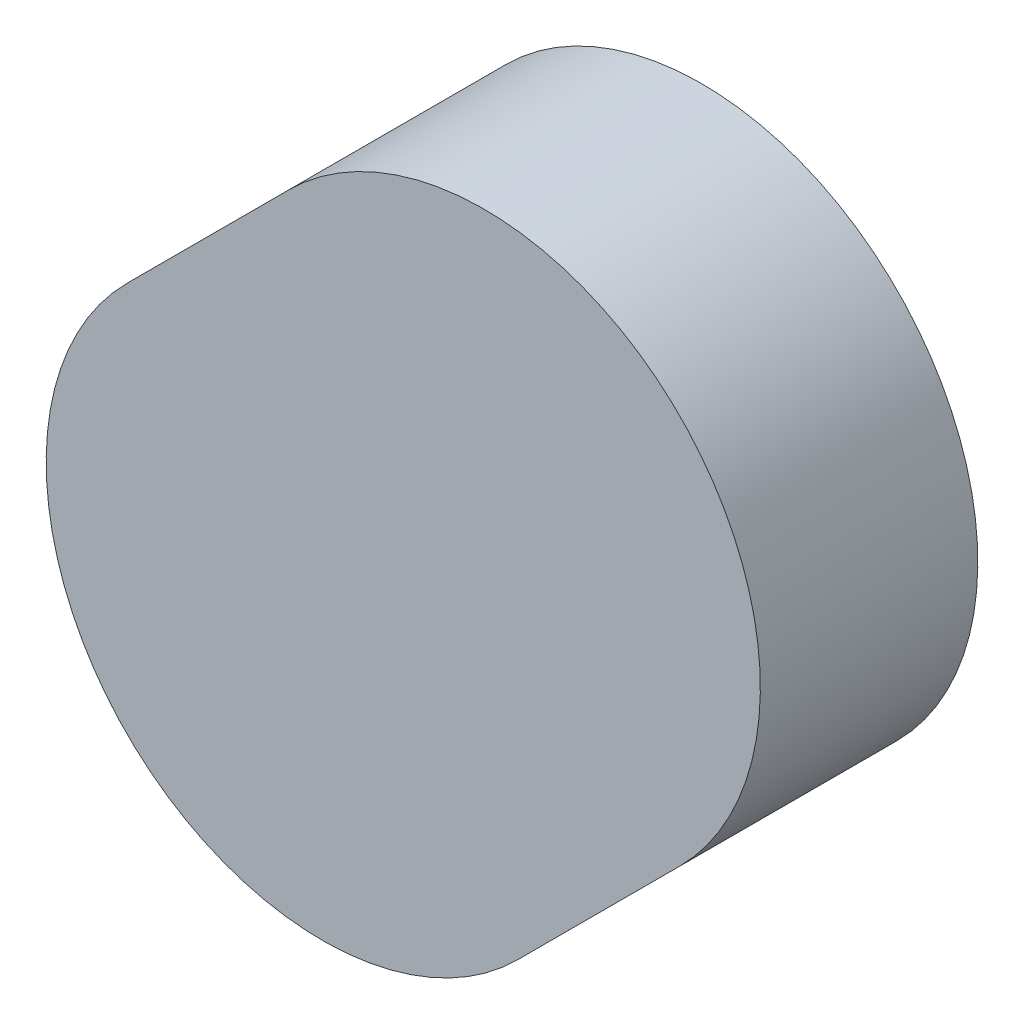
ISO-10303-21;
HEADER;
FILE_DESCRIPTION(('STEP AP214'),'2;1');
FILE_NAME('part.step','',(''),(''),'','','');
FILE_SCHEMA(('AUTOMOTIVE_DESIGN { 1 0 10303 214 1 1 1 1 }'));
ENDSEC;
DATA;
#1=APPLICATION_CONTEXT('core data for automotive mechanical design processes');
#2=APPLICATION_PROTOCOL_DEFINITION('international standard','automotive_design',2000,#1);
#3=PRODUCT_CONTEXT('',#1,'mechanical');
#4=PRODUCT('Part','Part','',(#3));
#5=PRODUCT_RELATED_PRODUCT_CATEGORY('part','',(#4));
#6=PRODUCT_DEFINITION_FORMATION('','',#4);
#7=PRODUCT_DEFINITION_CONTEXT('part definition',#1,'design');
#8=PRODUCT_DEFINITION('design','',#6,#7);
#9=PRODUCT_DEFINITION_SHAPE('','',#8);
#10=(LENGTH_UNIT() NAMED_UNIT(*) SI_UNIT(.MILLI.,.METRE.));
#11=(NAMED_UNIT(*) PLANE_ANGLE_UNIT() SI_UNIT($,.RADIAN.));
#12=(NAMED_UNIT(*) SI_UNIT($,.STERADIAN.) SOLID_ANGLE_UNIT());
#13=UNCERTAINTY_MEASURE_WITH_UNIT(LENGTH_MEASURE(1.E-05),#10,'distance_accuracy_value','');
#14=(GEOMETRIC_REPRESENTATION_CONTEXT(3) GLOBAL_UNCERTAINTY_ASSIGNED_CONTEXT((#13)) GLOBAL_UNIT_ASSIGNED_CONTEXT((#10,
#11,#12)) REPRESENTATION_CONTEXT('',''));
#15=CARTESIAN_POINT('',(0.,0.,0.));
#16=DIRECTION('',(0.,0.,1.));
#17=DIRECTION('',(1.,0.,0.));
#18=AXIS2_PLACEMENT_3D('',#15,#16,#17);
#19=CARTESIAN_POINT('',(94.6930034,53.8461966,0.));
#20=DIRECTION('',(-0.707100745612061,0.707112816709517,0.));
#21=DIRECTION('',(0.707112816709517,0.707100745612061,0.));
#22=AXIS2_PLACEMENT_3D('',#19,#20,#21);
#23=PLANE('',#22);
#24=DIRECTION('',(0.707112816709517,0.707100745612061,0.));
#25=VECTOR('',#24,1.);
#26=CARTESIAN_POINT('',(94.6930034,53.8461966,0.1999996));
#27=LINE('',#26,#25);
#28=CARTESIAN_POINT('',(94.6930034,53.8461966,0.1999996));
#29=VERTEX_POINT('',#28);
#30=CARTESIAN_POINT('',(94.84179406,53.99498472,0.1999996));
#31=VERTEX_POINT('',#30);
#32=EDGE_CURVE('E11',#29,#31,#27,.T.);
#33=ORIENTED_EDGE('',*,*,#32,.F.);
#34=DIRECTION('',(0.,0.,1.));
#35=VECTOR('',#34,1.);
#36=CARTESIAN_POINT('',(94.6930034,53.8461966,0.));
#37=LINE('',#36,#35);
#38=CARTESIAN_POINT('',(94.6930034,53.8461966,0.));
#39=VERTEX_POINT('',#38);
#40=EDGE_CURVE('E24',#39,#29,#37,.T.);
#41=ORIENTED_EDGE('',*,*,#40,.F.);
#42=DIRECTION('',(0.707112816709517,0.707100745612061,0.));
#43=VECTOR('',#42,1.);
#44=CARTESIAN_POINT('',(94.6930034,53.8461966,0.));
#45=LINE('',#44,#43);
#46=CARTESIAN_POINT('',(94.84179406,53.99498472,0.));
#47=VERTEX_POINT('',#46);
#48=EDGE_CURVE('E75',#39,#47,#45,.T.);
#49=ORIENTED_EDGE('',*,*,#48,.T.);
#50=DIRECTION('',(0.,0.,1.));
#51=VECTOR('',#50,1.);
#52=CARTESIAN_POINT('',(94.84179406,53.99498472,0.));
#53=LINE('',#52,#51);
#54=EDGE_CURVE('E37',#47,#31,#53,.T.);
#55=ORIENTED_EDGE('',*,*,#54,.T.);
#56=EDGE_LOOP('',(#33,#41,#49,#55));
#57=FACE_BOUND('',#56,.T.);
#58=ADVANCED_FACE('F17',(#57),#23,.F.);
#59=CARTESIAN_POINT('',(94.662190659991,54.174591929991,0.));
#60=DIRECTION('',(0.,0.,-1.));
#61=DIRECTION('',(0.707099281189738,-0.707114281103809,0.));
#62=AXIS2_PLACEMENT_3D('',#59,#60,#61);
#63=CYLINDRICAL_SURFACE('',#62,0.25400025821944);
#64=CARTESIAN_POINT('',(94.662190659991,54.174591929991,0.1999996));
#65=DIRECTION('',(0.,0.,1.));
#66=DIRECTION('',(0.707099281189738,-0.707114281103809,0.));
#67=AXIS2_PLACEMENT_3D('',#64,#65,#66);
#68=CIRCLE('',#67,0.25400025821944);
#69=CARTESIAN_POINT('',(94.48258726,54.35419914,0.1999996));
#70=VERTEX_POINT('',#69);
#71=EDGE_CURVE('E83',#31,#70,#68,.T.);
#72=ORIENTED_EDGE('',*,*,#71,.F.);
#73=ORIENTED_EDGE('',*,*,#54,.F.);
#74=CARTESIAN_POINT('',(94.662190659991,54.174591929991,0.));
#75=DIRECTION('',(0.,0.,1.));
#76=DIRECTION('',(0.707099281189738,-0.707114281103809,0.));
#77=AXIS2_PLACEMENT_3D('',#74,#75,#76);
#78=CIRCLE('',#77,0.25400025821944);
#79=CARTESIAN_POINT('',(94.48258726,54.35419914,0.));
#80=VERTEX_POINT('',#79);
#81=EDGE_CURVE('E81',#47,#80,#78,.T.);
#82=ORIENTED_EDGE('',*,*,#81,.T.);
#83=DIRECTION('',(0.,0.,1.));
#84=VECTOR('',#83,1.);
#85=CARTESIAN_POINT('',(94.48258726,54.35419914,0.));
#86=LINE('',#85,#84);
#87=EDGE_CURVE('E67',#80,#70,#86,.T.);
#88=ORIENTED_EDGE('',*,*,#87,.T.);
#89=EDGE_LOOP('',(#72,#73,#82,#88));
#90=FACE_BOUND('',#89,.T.);
#91=ADVANCED_FACE('F89',(#90),#63,.T.);
#92=CARTESIAN_POINT('',(94.48258726,54.35419914,0.));
#93=DIRECTION('',(0.707106781186531,-0.707106781186565,0.));
#94=DIRECTION('',(-0.707106781186565,-0.707106781186531,0.));
#95=AXIS2_PLACEMENT_3D('',#92,#93,#94);
#96=PLANE('',#95);
#97=DIRECTION('',(-0.707106781186565,-0.707106781186531,0.));
#98=VECTOR('',#97,1.);
#99=CARTESIAN_POINT('',(94.48258726,54.35419914,0.1999996));
#100=LINE('',#99,#98);
#101=CARTESIAN_POINT('',(94.3337966,54.20540848,0.1999996));
#102=VERTEX_POINT('',#101);
#103=EDGE_CURVE('E71',#70,#102,#100,.T.);
#104=ORIENTED_EDGE('',*,*,#103,.F.);
#105=ORIENTED_EDGE('',*,*,#87,.F.);
#106=DIRECTION('',(-0.707106781186565,-0.707106781186531,0.));
#107=VECTOR('',#106,1.);
#108=CARTESIAN_POINT('',(94.48258726,54.35419914,0.));
#109=LINE('',#108,#107);
#110=CARTESIAN_POINT('',(94.3337966,54.20540848,0.));
#111=VERTEX_POINT('',#110);
#112=EDGE_CURVE('E63',#80,#111,#109,.T.);
#113=ORIENTED_EDGE('',*,*,#112,.T.);
#114=DIRECTION('',(0.,0.,1.));
#115=VECTOR('',#114,1.);
#116=CARTESIAN_POINT('',(94.3337966,54.20540848,0.));
#117=LINE('',#116,#115);
#118=EDGE_CURVE('E53',#111,#102,#117,.T.);
#119=ORIENTED_EDGE('',*,*,#118,.T.);
#120=EDGE_LOOP('',(#104,#105,#113,#119));
#121=FACE_BOUND('',#120,.T.);
#122=ADVANCED_FACE('F66',(#121),#96,.F.);
#123=CARTESIAN_POINT('',(94.513398729982,54.02580127,0.));
#124=DIRECTION('',(0.,0.,-1.));
#125=DIRECTION('',(-0.707096781055271,0.707116781176401,0.));
#126=AXIS2_PLACEMENT_3D('',#123,#124,#125);
#127=CYLINDRICAL_SURFACE('',#126,0.253999360192242);
#128=CARTESIAN_POINT('',(94.513398729982,54.02580127,0.1999996));
#129=DIRECTION('',(0.,0.,1.));
#130=DIRECTION('',(-0.707096781055271,0.707116781176401,0.));
#131=AXIS2_PLACEMENT_3D('',#128,#129,#130);
#132=CIRCLE('',#131,0.253999360192242);
#133=EDGE_CURVE('E59',#102,#29,#132,.T.);
#134=ORIENTED_EDGE('',*,*,#133,.F.);
#135=ORIENTED_EDGE('',*,*,#118,.F.);
#136=CARTESIAN_POINT('',(94.513398729982,54.02580127,0.));
#137=DIRECTION('',(0.,0.,1.));
#138=DIRECTION('',(-0.707096781055271,0.707116781176401,0.));
#139=AXIS2_PLACEMENT_3D('',#136,#137,#138);
#140=CIRCLE('',#139,0.253999360192242);
#141=EDGE_CURVE('E57',#111,#39,#140,.T.);
#142=ORIENTED_EDGE('',*,*,#141,.T.);
#143=ORIENTED_EDGE('',*,*,#40,.T.);
#144=EDGE_LOOP('',(#134,#135,#142,#143));
#145=FACE_BOUND('',#144,.T.);
#146=ADVANCED_FACE('F55',(#145),#127,.T.);
#147=CARTESIAN_POINT('',(94.6930034,53.8461966,0.));
#148=DIRECTION('',(0.,0.,-1.));
#149=DIRECTION('',(-1.,0.,0.));
#150=AXIS2_PLACEMENT_3D('',#147,#148,#149);
#151=PLANE('',#150);
#152=ORIENTED_EDGE('',*,*,#141,.F.);
#153=ORIENTED_EDGE('',*,*,#112,.F.);
#154=ORIENTED_EDGE('',*,*,#81,.F.);
#155=ORIENTED_EDGE('',*,*,#48,.F.);
#156=EDGE_LOOP('',(#152,#153,#154,#155));
#157=FACE_BOUND('',#156,.T.);
#158=ADVANCED_FACE('F74',(#157),#151,.T.);
#159=CARTESIAN_POINT('',(94.6930034,53.8461966,0.1999996));
#160=DIRECTION('',(0.,0.,-1.));
#161=DIRECTION('',(-1.,0.,0.));
#162=AXIS2_PLACEMENT_3D('',#159,#160,#161);
#163=PLANE('',#162);
#164=ORIENTED_EDGE('',*,*,#32,.T.);
#165=ORIENTED_EDGE('',*,*,#71,.T.);
#166=ORIENTED_EDGE('',*,*,#103,.T.);
#167=ORIENTED_EDGE('',*,*,#133,.T.);
#168=EDGE_LOOP('',(#164,#165,#166,#167));
#169=FACE_BOUND('',#168,.T.);
#170=ADVANCED_FACE('F91',(#169),#163,.F.);
#171=CLOSED_SHELL('',(#58,#91,#122,#146,#158,#170));
#172=MANIFOLD_SOLID_BREP('B1',#171);
#173=ADVANCED_BREP_SHAPE_REPRESENTATION('',(#18,#172),#14);
#174=SHAPE_DEFINITION_REPRESENTATION(#9,#173);
ENDSEC;
END-ISO-10303-21;
